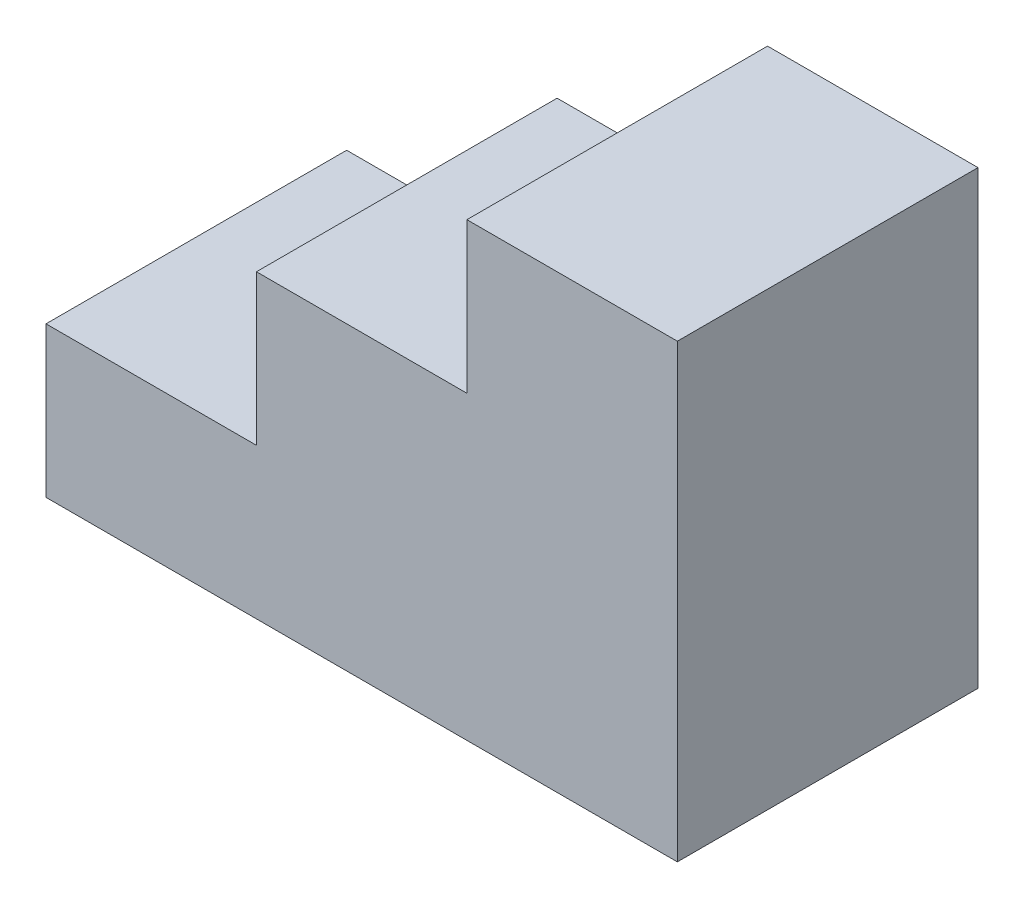
ISO-10303-21;
HEADER;
FILE_DESCRIPTION(('STEP AP214'),'2;1');
FILE_NAME('part.step','',(''),(''),'','','');
FILE_SCHEMA(('AUTOMOTIVE_DESIGN { 1 0 10303 214 1 1 1 1 }'));
ENDSEC;
DATA;
#1=APPLICATION_CONTEXT('core data for automotive mechanical design processes');
#2=APPLICATION_PROTOCOL_DEFINITION('international standard','automotive_design',2000,#1);
#3=PRODUCT_CONTEXT('',#1,'mechanical');
#4=PRODUCT('Part','Part','',(#3));
#5=PRODUCT_RELATED_PRODUCT_CATEGORY('part','',(#4));
#6=PRODUCT_DEFINITION_FORMATION('','',#4);
#7=PRODUCT_DEFINITION_CONTEXT('part definition',#1,'design');
#8=PRODUCT_DEFINITION('design','',#6,#7);
#9=PRODUCT_DEFINITION_SHAPE('','',#8);
#10=(LENGTH_UNIT() NAMED_UNIT(*) SI_UNIT(.MILLI.,.METRE.));
#11=(NAMED_UNIT(*) PLANE_ANGLE_UNIT() SI_UNIT($,.RADIAN.));
#12=(NAMED_UNIT(*) SI_UNIT($,.STERADIAN.) SOLID_ANGLE_UNIT());
#13=UNCERTAINTY_MEASURE_WITH_UNIT(LENGTH_MEASURE(1.E-05),#10,'distance_accuracy_value','');
#14=(GEOMETRIC_REPRESENTATION_CONTEXT(3) GLOBAL_UNCERTAINTY_ASSIGNED_CONTEXT((#13)) GLOBAL_UNIT_ASSIGNED_CONTEXT((#10,
#11,#12)) REPRESENTATION_CONTEXT('',''));
#15=CARTESIAN_POINT('',(0.,0.,0.));
#16=DIRECTION('',(0.,0.,1.));
#17=DIRECTION('',(1.,0.,0.));
#18=AXIS2_PLACEMENT_3D('',#15,#16,#17);
#19=CARTESIAN_POINT('',(35.,25.,50.));
#20=DIRECTION('',(0.,-1.,0.));
#21=DIRECTION('',(1.,0.,0.));
#22=AXIS2_PLACEMENT_3D('',#19,#20,#21);
#23=PLANE('',#22);
#24=DIRECTION('',(-1.,0.,0.));
#25=VECTOR('',#24,1.);
#26=CARTESIAN_POINT('',(35.,25.,0.));
#27=LINE('',#26,#25);
#28=CARTESIAN_POINT('',(35.,25.,0.));
#29=VERTEX_POINT('',#28);
#30=CARTESIAN_POINT('',(0.,25.,0.));
#31=VERTEX_POINT('',#30);
#32=EDGE_CURVE('E141',#29,#31,#27,.T.);
#33=ORIENTED_EDGE('',*,*,#32,.T.);
#34=DIRECTION('',(0.,0.,-1.));
#35=VECTOR('',#34,1.);
#36=CARTESIAN_POINT('',(0.,25.,50.));
#37=LINE('',#36,#35);
#38=CARTESIAN_POINT('',(0.,25.,50.));
#39=VERTEX_POINT('',#38);
#40=EDGE_CURVE('E11',#39,#31,#37,.T.);
#41=ORIENTED_EDGE('',*,*,#40,.F.);
#42=DIRECTION('',(-1.,0.,0.));
#43=VECTOR('',#42,1.);
#44=CARTESIAN_POINT('',(35.,25.,50.));
#45=LINE('',#44,#43);
#46=CARTESIAN_POINT('',(35.,25.,50.));
#47=VERTEX_POINT('',#46);
#48=EDGE_CURVE('E163',#47,#39,#45,.T.);
#49=ORIENTED_EDGE('',*,*,#48,.F.);
#50=DIRECTION('',(0.,0.,-1.));
#51=VECTOR('',#50,1.);
#52=CARTESIAN_POINT('',(35.,25.,50.));
#53=LINE('',#52,#51);
#54=EDGE_CURVE('E137',#47,#29,#53,.T.);
#55=ORIENTED_EDGE('',*,*,#54,.T.);
#56=EDGE_LOOP('',(#33,#41,#49,#55));
#57=FACE_BOUND('',#56,.T.);
#58=ADVANCED_FACE('F40',(#57),#23,.F.);
#59=CARTESIAN_POINT('',(0.,25.,50.));
#60=DIRECTION('',(1.,0.,0.));
#61=DIRECTION('',(0.,1.,0.));
#62=AXIS2_PLACEMENT_3D('',#59,#60,#61);
#63=PLANE('',#62);
#64=DIRECTION('',(0.,-1.,0.));
#65=VECTOR('',#64,1.);
#66=CARTESIAN_POINT('',(0.,25.,0.));
#67=LINE('',#66,#65);
#68=CARTESIAN_POINT('',(0.,0.,0.));
#69=VERTEX_POINT('',#68);
#70=EDGE_CURVE('E145',#31,#69,#67,.T.);
#71=ORIENTED_EDGE('',*,*,#70,.T.);
#72=DIRECTION('',(0.,0.,-1.));
#73=VECTOR('',#72,1.);
#74=CARTESIAN_POINT('',(0.,0.,50.));
#75=LINE('',#74,#73);
#76=CARTESIAN_POINT('',(0.,0.,50.));
#77=VERTEX_POINT('',#76);
#78=EDGE_CURVE('E49',#77,#69,#75,.T.);
#79=ORIENTED_EDGE('',*,*,#78,.F.);
#80=DIRECTION('',(0.,-1.,0.));
#81=VECTOR('',#80,1.);
#82=CARTESIAN_POINT('',(0.,25.,50.));
#83=LINE('',#82,#81);
#84=EDGE_CURVE('E100',#39,#77,#83,.T.);
#85=ORIENTED_EDGE('',*,*,#84,.F.);
#86=ORIENTED_EDGE('',*,*,#40,.T.);
#87=EDGE_LOOP('',(#71,#79,#85,#86));
#88=FACE_BOUND('',#87,.T.);
#89=ADVANCED_FACE('F209',(#88),#63,.F.);
#90=CARTESIAN_POINT('',(0.,0.,50.));
#91=DIRECTION('',(0.,1.,0.));
#92=DIRECTION('',(0.,0.,1.));
#93=AXIS2_PLACEMENT_3D('',#90,#91,#92);
#94=PLANE('',#93);
#95=DIRECTION('',(1.,0.,0.));
#96=VECTOR('',#95,1.);
#97=CARTESIAN_POINT('',(0.,0.,0.));
#98=LINE('',#97,#96);
#99=CARTESIAN_POINT('',(105.,0.,0.));
#100=VERTEX_POINT('',#99);
#101=EDGE_CURVE('E148',#69,#100,#98,.T.);
#102=ORIENTED_EDGE('',*,*,#101,.T.);
#103=DIRECTION('',(0.,0.,-1.));
#104=VECTOR('',#103,1.);
#105=CARTESIAN_POINT('',(105.,0.,50.));
#106=LINE('',#105,#104);
#107=CARTESIAN_POINT('',(105.,0.,50.));
#108=VERTEX_POINT('',#107);
#109=EDGE_CURVE('E174',#108,#100,#106,.T.);
#110=ORIENTED_EDGE('',*,*,#109,.F.);
#111=DIRECTION('',(1.,0.,0.));
#112=VECTOR('',#111,1.);
#113=CARTESIAN_POINT('',(0.,0.,50.));
#114=LINE('',#113,#112);
#115=EDGE_CURVE('E184',#77,#108,#114,.T.);
#116=ORIENTED_EDGE('',*,*,#115,.F.);
#117=ORIENTED_EDGE('',*,*,#78,.T.);
#118=EDGE_LOOP('',(#102,#110,#116,#117));
#119=FACE_BOUND('',#118,.T.);
#120=ADVANCED_FACE('F182',(#119),#94,.F.);
#121=CARTESIAN_POINT('',(105.,0.,50.));
#122=DIRECTION('',(-1.,0.,0.));
#123=DIRECTION('',(0.,0.,1.));
#124=AXIS2_PLACEMENT_3D('',#121,#122,#123);
#125=PLANE('',#124);
#126=DIRECTION('',(0.,1.,0.));
#127=VECTOR('',#126,1.);
#128=CARTESIAN_POINT('',(105.,0.,0.));
#129=LINE('',#128,#127);
#130=CARTESIAN_POINT('',(105.,75.,0.));
#131=VERTEX_POINT('',#130);
#132=EDGE_CURVE('E151',#100,#131,#129,.T.);
#133=ORIENTED_EDGE('',*,*,#132,.T.);
#134=DIRECTION('',(0.,0.,-1.));
#135=VECTOR('',#134,1.);
#136=CARTESIAN_POINT('',(105.,75.,50.));
#137=LINE('',#136,#135);
#138=CARTESIAN_POINT('',(105.,75.,50.));
#139=VERTEX_POINT('',#138);
#140=EDGE_CURVE('E170',#139,#131,#137,.T.);
#141=ORIENTED_EDGE('',*,*,#140,.F.);
#142=DIRECTION('',(0.,1.,0.));
#143=VECTOR('',#142,1.);
#144=CARTESIAN_POINT('',(105.,0.,50.));
#145=LINE('',#144,#143);
#146=EDGE_CURVE('E197',#108,#139,#145,.T.);
#147=ORIENTED_EDGE('',*,*,#146,.F.);
#148=ORIENTED_EDGE('',*,*,#109,.T.);
#149=EDGE_LOOP('',(#133,#141,#147,#148));
#150=FACE_BOUND('',#149,.T.);
#151=ADVANCED_FACE('F192',(#150),#125,.F.);
#152=CARTESIAN_POINT('',(105.,75.,50.));
#153=DIRECTION('',(0.,-1.,0.));
#154=DIRECTION('',(0.,0.,-1.));
#155=AXIS2_PLACEMENT_3D('',#152,#153,#154);
#156=PLANE('',#155);
#157=DIRECTION('',(-1.,0.,0.));
#158=VECTOR('',#157,1.);
#159=CARTESIAN_POINT('',(105.,75.,0.));
#160=LINE('',#159,#158);
#161=CARTESIAN_POINT('',(70.,75.,0.));
#162=VERTEX_POINT('',#161);
#163=EDGE_CURVE('E154',#131,#162,#160,.T.);
#164=ORIENTED_EDGE('',*,*,#163,.T.);
#165=DIRECTION('',(0.,0.,-1.));
#166=VECTOR('',#165,1.);
#167=CARTESIAN_POINT('',(70.,75.,50.));
#168=LINE('',#167,#166);
#169=CARTESIAN_POINT('',(70.,75.,50.));
#170=VERTEX_POINT('',#169);
#171=EDGE_CURVE('E130',#170,#162,#168,.T.);
#172=ORIENTED_EDGE('',*,*,#171,.F.);
#173=DIRECTION('',(-1.,0.,0.));
#174=VECTOR('',#173,1.);
#175=CARTESIAN_POINT('',(105.,75.,50.));
#176=LINE('',#175,#174);
#177=EDGE_CURVE('E119',#139,#170,#176,.T.);
#178=ORIENTED_EDGE('',*,*,#177,.F.);
#179=ORIENTED_EDGE('',*,*,#140,.T.);
#180=EDGE_LOOP('',(#164,#172,#178,#179));
#181=FACE_BOUND('',#180,.T.);
#182=ADVANCED_FACE('F195',(#181),#156,.F.);
#183=CARTESIAN_POINT('',(70.,75.,50.));
#184=DIRECTION('',(1.,0.,0.));
#185=DIRECTION('',(0.,0.,-1.));
#186=AXIS2_PLACEMENT_3D('',#183,#184,#185);
#187=PLANE('',#186);
#188=DIRECTION('',(0.,-1.,0.));
#189=VECTOR('',#188,1.);
#190=CARTESIAN_POINT('',(70.,75.,0.));
#191=LINE('',#190,#189);
#192=CARTESIAN_POINT('',(70.,50.,0.));
#193=VERTEX_POINT('',#192);
#194=EDGE_CURVE('E128',#162,#193,#191,.T.);
#195=ORIENTED_EDGE('',*,*,#194,.T.);
#196=DIRECTION('',(0.,0.,-1.));
#197=VECTOR('',#196,1.);
#198=CARTESIAN_POINT('',(70.,50.,50.));
#199=LINE('',#198,#197);
#200=CARTESIAN_POINT('',(70.,50.,50.));
#201=VERTEX_POINT('',#200);
#202=EDGE_CURVE('E125',#201,#193,#199,.T.);
#203=ORIENTED_EDGE('',*,*,#202,.F.);
#204=DIRECTION('',(0.,-1.,0.));
#205=VECTOR('',#204,1.);
#206=CARTESIAN_POINT('',(70.,75.,50.));
#207=LINE('',#206,#205);
#208=EDGE_CURVE('E113',#170,#201,#207,.T.);
#209=ORIENTED_EDGE('',*,*,#208,.F.);
#210=ORIENTED_EDGE('',*,*,#171,.T.);
#211=EDGE_LOOP('',(#195,#203,#209,#210));
#212=FACE_BOUND('',#211,.T.);
#213=ADVANCED_FACE('F126',(#212),#187,.F.);
#214=CARTESIAN_POINT('',(70.,50.,50.));
#215=DIRECTION('',(0.,-1.,0.));
#216=DIRECTION('',(0.,0.,-1.));
#217=AXIS2_PLACEMENT_3D('',#214,#215,#216);
#218=PLANE('',#217);
#219=DIRECTION('',(-1.,0.,0.));
#220=VECTOR('',#219,1.);
#221=CARTESIAN_POINT('',(70.,50.,0.));
#222=LINE('',#221,#220);
#223=CARTESIAN_POINT('',(35.,50.,0.));
#224=VERTEX_POINT('',#223);
#225=EDGE_CURVE('E86',#193,#224,#222,.T.);
#226=ORIENTED_EDGE('',*,*,#225,.T.);
#227=DIRECTION('',(0.,0.,-1.));
#228=VECTOR('',#227,1.);
#229=CARTESIAN_POINT('',(35.,50.,50.));
#230=LINE('',#229,#228);
#231=CARTESIAN_POINT('',(35.,50.,50.));
#232=VERTEX_POINT('',#231);
#233=EDGE_CURVE('E131',#232,#224,#230,.T.);
#234=ORIENTED_EDGE('',*,*,#233,.F.);
#235=DIRECTION('',(-1.,0.,0.));
#236=VECTOR('',#235,1.);
#237=CARTESIAN_POINT('',(70.,50.,50.));
#238=LINE('',#237,#236);
#239=EDGE_CURVE('E117',#201,#232,#238,.T.);
#240=ORIENTED_EDGE('',*,*,#239,.F.);
#241=ORIENTED_EDGE('',*,*,#202,.T.);
#242=EDGE_LOOP('',(#226,#234,#240,#241));
#243=FACE_BOUND('',#242,.T.);
#244=ADVANCED_FACE('F133',(#243),#218,.F.);
#245=CARTESIAN_POINT('',(35.,50.,50.));
#246=DIRECTION('',(1.,0.,0.));
#247=DIRECTION('',(0.,1.,0.));
#248=AXIS2_PLACEMENT_3D('',#245,#246,#247);
#249=PLANE('',#248);
#250=DIRECTION('',(0.,-1.,0.));
#251=VECTOR('',#250,1.);
#252=CARTESIAN_POINT('',(35.,50.,0.));
#253=LINE('',#252,#251);
#254=EDGE_CURVE('E92',#224,#29,#253,.T.);
#255=ORIENTED_EDGE('',*,*,#254,.T.);
#256=ORIENTED_EDGE('',*,*,#54,.F.);
#257=DIRECTION('',(0.,-1.,0.));
#258=VECTOR('',#257,1.);
#259=CARTESIAN_POINT('',(35.,50.,50.));
#260=LINE('',#259,#258);
#261=EDGE_CURVE('E57',#232,#47,#260,.T.);
#262=ORIENTED_EDGE('',*,*,#261,.F.);
#263=ORIENTED_EDGE('',*,*,#233,.T.);
#264=EDGE_LOOP('',(#255,#256,#262,#263));
#265=FACE_BOUND('',#264,.T.);
#266=ADVANCED_FACE('F225',(#265),#249,.F.);
#267=CARTESIAN_POINT('',(0.,0.,50.));
#268=DIRECTION('',(0.,0.,1.));
#269=DIRECTION('',(1.,0.,0.));
#270=AXIS2_PLACEMENT_3D('',#267,#268,#269);
#271=PLANE('',#270);
#272=ORIENTED_EDGE('',*,*,#48,.T.);
#273=ORIENTED_EDGE('',*,*,#84,.T.);
#274=ORIENTED_EDGE('',*,*,#115,.T.);
#275=ORIENTED_EDGE('',*,*,#146,.T.);
#276=ORIENTED_EDGE('',*,*,#177,.T.);
#277=ORIENTED_EDGE('',*,*,#208,.T.);
#278=ORIENTED_EDGE('',*,*,#239,.T.);
#279=ORIENTED_EDGE('',*,*,#261,.T.);
#280=EDGE_LOOP('',(#272,#273,#274,#275,#276,#277,#278,#279));
#281=FACE_BOUND('',#280,.T.);
#282=ADVANCED_FACE('F115',(#281),#271,.T.);
#283=CARTESIAN_POINT('',(0.,0.,0.));
#284=DIRECTION('',(0.,0.,1.));
#285=DIRECTION('',(1.,0.,0.));
#286=AXIS2_PLACEMENT_3D('',#283,#284,#285);
#287=PLANE('',#286);
#288=ORIENTED_EDGE('',*,*,#32,.F.);
#289=ORIENTED_EDGE('',*,*,#254,.F.);
#290=ORIENTED_EDGE('',*,*,#225,.F.);
#291=ORIENTED_EDGE('',*,*,#194,.F.);
#292=ORIENTED_EDGE('',*,*,#163,.F.);
#293=ORIENTED_EDGE('',*,*,#132,.F.);
#294=ORIENTED_EDGE('',*,*,#101,.F.);
#295=ORIENTED_EDGE('',*,*,#70,.F.);
#296=EDGE_LOOP('',(#288,#289,#290,#291,#292,#293,#294,#295));
#297=FACE_BOUND('',#296,.T.);
#298=ADVANCED_FACE('F188',(#297),#287,.F.);
#299=CLOSED_SHELL('',(#58,#89,#120,#151,#182,#213,#244,#266,#282,#298));
#300=MANIFOLD_SOLID_BREP('B2',#299);
#301=ADVANCED_BREP_SHAPE_REPRESENTATION('',(#18,#300),#14);
#302=SHAPE_DEFINITION_REPRESENTATION(#9,#301);
ENDSEC;
END-ISO-10303-21;
